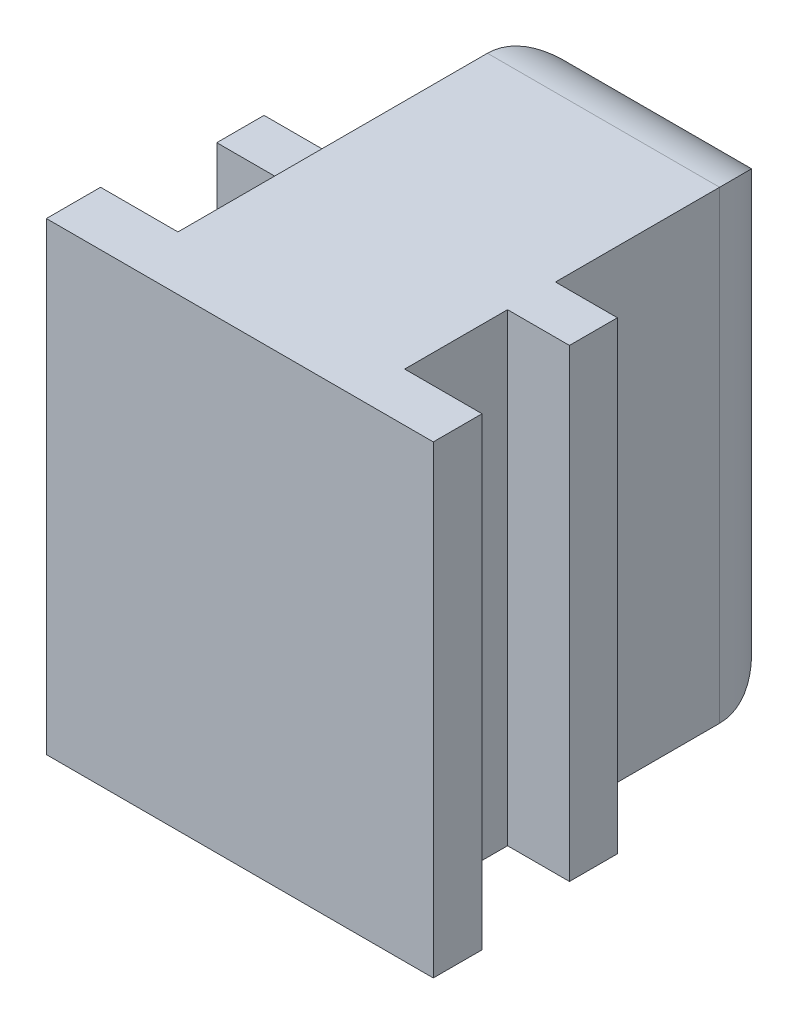
ISO-10303-21;
HEADER;
FILE_DESCRIPTION(('STEP AP214'),'2;1');
FILE_NAME('part.step','',(''),(''),'','','');
FILE_SCHEMA(('AUTOMOTIVE_DESIGN { 1 0 10303 214 1 1 1 1 }'));
ENDSEC;
DATA;
#1=APPLICATION_CONTEXT('core data for automotive mechanical design processes');
#2=APPLICATION_PROTOCOL_DEFINITION('international standard','automotive_design',2000,#1);
#3=PRODUCT_CONTEXT('',#1,'mechanical');
#4=PRODUCT('Part','Part','',(#3));
#5=PRODUCT_RELATED_PRODUCT_CATEGORY('part','',(#4));
#6=PRODUCT_DEFINITION_FORMATION('','',#4);
#7=PRODUCT_DEFINITION_CONTEXT('part definition',#1,'design');
#8=PRODUCT_DEFINITION('design','',#6,#7);
#9=PRODUCT_DEFINITION_SHAPE('','',#8);
#10=(LENGTH_UNIT() NAMED_UNIT(*) SI_UNIT(.MILLI.,.METRE.));
#11=(NAMED_UNIT(*) PLANE_ANGLE_UNIT() SI_UNIT($,.RADIAN.));
#12=(NAMED_UNIT(*) SI_UNIT($,.STERADIAN.) SOLID_ANGLE_UNIT());
#13=UNCERTAINTY_MEASURE_WITH_UNIT(LENGTH_MEASURE(1.E-05),#10,'distance_accuracy_value','');
#14=(GEOMETRIC_REPRESENTATION_CONTEXT(3) GLOBAL_UNCERTAINTY_ASSIGNED_CONTEXT((#13)) GLOBAL_UNIT_ASSIGNED_CONTEXT((#10,
#11,#12)) REPRESENTATION_CONTEXT('',''));
#15=CARTESIAN_POINT('',(0.,0.,0.));
#16=DIRECTION('',(0.,0.,1.));
#17=DIRECTION('',(1.,0.,0.));
#18=AXIS2_PLACEMENT_3D('',#15,#16,#17);
#19=CARTESIAN_POINT('',(0.,0.,4.2));
#20=DIRECTION('',(0.,0.,1.));
#21=DIRECTION('',(1.,0.,0.));
#22=AXIS2_PLACEMENT_3D('',#19,#20,#21);
#23=PLANE('',#22);
#24=DIRECTION('',(0.,1.,0.));
#25=VECTOR('',#24,1.);
#26=CARTESIAN_POINT('',(-3.03853997780115,1.18298219692962,4.2));
#27=LINE('',#26,#25);
#28=CARTESIAN_POINT('',(-3.03853997780115,-4.81701780307038,4.2));
#29=VERTEX_POINT('',#28);
#30=CARTESIAN_POINT('',(-3.03853997780115,1.18298219692962,4.2));
#31=VERTEX_POINT('',#30);
#32=EDGE_CURVE('E232',#29,#31,#27,.T.);
#33=ORIENTED_EDGE('',*,*,#32,.F.);
#34=DIRECTION('',(-1.,0.,0.));
#35=VECTOR('',#34,1.);
#36=CARTESIAN_POINT('',(-3.03853997780115,-4.81701780307038,4.2));
#37=LINE('',#36,#35);
#38=CARTESIAN_POINT('',(1.96146002219886,-4.81701780307038,4.2));
#39=VERTEX_POINT('',#38);
#40=EDGE_CURVE('E59',#39,#29,#37,.T.);
#41=ORIENTED_EDGE('',*,*,#40,.F.);
#42=DIRECTION('',(0.,-1.,0.));
#43=VECTOR('',#42,1.);
#44=CARTESIAN_POINT('',(1.96146002219885,1.18298219692962,4.2));
#45=LINE('',#44,#43);
#46=CARTESIAN_POINT('',(1.96146002219885,1.18298219692962,4.2));
#47=VERTEX_POINT('',#46);
#48=EDGE_CURVE('E241',#47,#39,#45,.T.);
#49=ORIENTED_EDGE('',*,*,#48,.F.);
#50=DIRECTION('',(1.,0.,0.));
#51=VECTOR('',#50,1.);
#52=CARTESIAN_POINT('',(1.96146002219885,1.18298219692962,4.2));
#53=LINE('',#52,#51);
#54=EDGE_CURVE('E233',#31,#47,#53,.T.);
#55=ORIENTED_EDGE('',*,*,#54,.F.);
#56=EDGE_LOOP('',(#33,#41,#49,#55));
#57=FACE_BOUND('',#56,.T.);
#58=ADVANCED_FACE('F44',(#57),#23,.T.);
#59=CARTESIAN_POINT('',(-3.53853997780115,1.18298219692962,3.5));
#60=DIRECTION('',(0.,0.,1.));
#61=DIRECTION('',(1.,0.,0.));
#62=AXIS2_PLACEMENT_3D('',#59,#60,#61);
#63=PLANE('',#62);
#64=DIRECTION('',(1.,0.,0.));
#65=VECTOR('',#64,1.);
#66=CARTESIAN_POINT('',(-3.03853997780115,-4.81701780307038,3.5));
#67=LINE('',#66,#65);
#68=CARTESIAN_POINT('',(-3.03853997780115,-4.81701780307038,3.5));
#69=VERTEX_POINT('',#68);
#70=CARTESIAN_POINT('',(-2.0806114774885,-4.81701780307038,3.5));
#71=VERTEX_POINT('',#70);
#72=EDGE_CURVE('E217',#69,#71,#67,.T.);
#73=ORIENTED_EDGE('',*,*,#72,.F.);
#74=DIRECTION('',(0.,-1.,0.));
#75=VECTOR('',#74,1.);
#76=CARTESIAN_POINT('',(-3.03853997780115,1.18298219692962,3.5));
#77=LINE('',#76,#75);
#78=CARTESIAN_POINT('',(-3.03853997780115,1.18298219692962,3.5));
#79=VERTEX_POINT('',#78);
#80=EDGE_CURVE('E225',#79,#69,#77,.T.);
#81=ORIENTED_EDGE('',*,*,#80,.F.);
#82=DIRECTION('',(1.,0.,0.));
#83=VECTOR('',#82,1.);
#84=CARTESIAN_POINT('',(-3.53853997780115,1.18298219692962,3.5));
#85=LINE('',#84,#83);
#86=CARTESIAN_POINT('',(-2.03853997780115,1.18298219692962,3.5));
#87=VERTEX_POINT('',#86);
#88=EDGE_CURVE('E255',#79,#87,#85,.T.);
#89=ORIENTED_EDGE('',*,*,#88,.T.);
#90=DIRECTION('',(0.,-1.,0.));
#91=VECTOR('',#90,1.);
#92=CARTESIAN_POINT('',(-2.03853997780115,1.18298219692962,3.5));
#93=LINE('',#92,#91);
#94=CARTESIAN_POINT('',(-2.03853997780115,1.0826631695906,3.5));
#95=VERTEX_POINT('',#94);
#96=EDGE_CURVE('E253',#87,#95,#93,.T.);
#97=ORIENTED_EDGE('',*,*,#96,.T.);
#98=DIRECTION('',(-1.,0.,0.));
#99=VECTOR('',#98,1.);
#100=CARTESIAN_POINT('',(-2.0806114774885,1.0826631695906,3.5));
#101=LINE('',#100,#99);
#102=CARTESIAN_POINT('',(-2.0806114774885,1.0826631695906,3.5));
#103=VERTEX_POINT('',#102);
#104=EDGE_CURVE('E261',#95,#103,#101,.T.);
#105=ORIENTED_EDGE('',*,*,#104,.T.);
#106=DIRECTION('',(0.,-1.,0.));
#107=VECTOR('',#106,1.);
#108=CARTESIAN_POINT('',(-2.0806114774885,1.0826631695906,3.5));
#109=LINE('',#108,#107);
#110=EDGE_CURVE('E228',#103,#71,#109,.T.);
#111=ORIENTED_EDGE('',*,*,#110,.T.);
#112=EDGE_LOOP('',(#73,#81,#89,#97,#105,#111));
#113=FACE_BOUND('',#112,.T.);
#114=ADVANCED_FACE('F224',(#113),#63,.F.);
#115=CARTESIAN_POINT('',(1.96146002219885,0.,0.));
#116=DIRECTION('',(1.,0.,0.));
#117=DIRECTION('',(0.,1.,0.));
#118=AXIS2_PLACEMENT_3D('',#115,#116,#117);
#119=PLANE('',#118);
#120=ORIENTED_EDGE('',*,*,#48,.T.);
#121=DIRECTION('',(0.,0.,1.));
#122=VECTOR('',#121,1.);
#123=CARTESIAN_POINT('',(1.96146002219886,-4.81701780307038,4.2));
#124=LINE('',#123,#122);
#125=CARTESIAN_POINT('',(1.96146002219886,-4.81701780307038,3.56971509983861));
#126=VERTEX_POINT('',#125);
#127=EDGE_CURVE('E229',#126,#39,#124,.T.);
#128=ORIENTED_EDGE('',*,*,#127,.F.);
#129=DIRECTION('',(0.,1.,0.));
#130=VECTOR('',#129,1.);
#131=CARTESIAN_POINT('',(1.96146002219885,1.18298219692962,3.56971509983861));
#132=LINE('',#131,#130);
#133=CARTESIAN_POINT('',(1.96146002219885,1.18298219692962,3.56971509983861));
#134=VERTEX_POINT('',#133);
#135=EDGE_CURVE('E244',#126,#134,#132,.T.);
#136=ORIENTED_EDGE('',*,*,#135,.T.);
#137=DIRECTION('',(0.,0.,-1.));
#138=VECTOR('',#137,1.);
#139=CARTESIAN_POINT('',(1.96146002219885,1.18298219692962,3.56971509983861));
#140=LINE('',#139,#138);
#141=EDGE_CURVE('E445',#47,#134,#140,.T.);
#142=ORIENTED_EDGE('',*,*,#141,.F.);
#143=EDGE_LOOP('',(#120,#128,#136,#142));
#144=FACE_BOUND('',#143,.T.);
#145=ADVANCED_FACE('F511',(#144),#119,.T.);
#146=CARTESIAN_POINT('',(-3.03853997780115,0.,0.));
#147=DIRECTION('',(-1.,0.,0.));
#148=DIRECTION('',(0.,-1.,0.));
#149=AXIS2_PLACEMENT_3D('',#146,#147,#148);
#150=PLANE('',#149);
#151=ORIENTED_EDGE('',*,*,#80,.T.);
#152=DIRECTION('',(0.,0.,-1.));
#153=VECTOR('',#152,1.);
#154=CARTESIAN_POINT('',(-3.03853997780115,-4.81701780307038,4.2));
#155=LINE('',#154,#153);
#156=EDGE_CURVE('E212',#29,#69,#155,.T.);
#157=ORIENTED_EDGE('',*,*,#156,.F.);
#158=ORIENTED_EDGE('',*,*,#32,.T.);
#159=DIRECTION('',(0.,0.,-1.));
#160=VECTOR('',#159,1.);
#161=CARTESIAN_POINT('',(-3.03853997780115,1.18298219692962,3.5));
#162=LINE('',#161,#160);
#163=EDGE_CURVE('E67',#31,#79,#162,.T.);
#164=ORIENTED_EDGE('',*,*,#163,.T.);
#165=EDGE_LOOP('',(#151,#157,#158,#164));
#166=FACE_BOUND('',#165,.T.);
#167=ADVANCED_FACE('F231',(#166),#150,.T.);
#168=CARTESIAN_POINT('',(-2.03853997780115,-4.81701780307038,3.5));
#169=DIRECTION('',(0.,1.,0.));
#170=DIRECTION('',(0.,0.,1.));
#171=AXIS2_PLACEMENT_3D('',#168,#169,#170);
#172=PLANE('',#171);
#173=DIRECTION('',(-1.,0.,0.));
#174=VECTOR('',#173,1.);
#175=CARTESIAN_POINT('',(1.76146002219886,-4.81701780307038,2.24019988601398));
#176=LINE('',#175,#174);
#177=CARTESIAN_POINT('',(1.76146002219886,-4.81701780307038,2.24019988601398));
#178=VERTEX_POINT('',#177);
#179=CARTESIAN_POINT('',(0.961460022198855,-4.81701780307038,2.24019988601398));
#180=VERTEX_POINT('',#179);
#181=EDGE_CURVE('E325',#178,#180,#176,.T.);
#182=ORIENTED_EDGE('',*,*,#181,.T.);
#183=DIRECTION('',(0.,0.,-1.));
#184=VECTOR('',#183,1.);
#185=CARTESIAN_POINT('',(0.961460022198855,-4.81701780307038,3.5));
#186=LINE('',#185,#184);
#187=CARTESIAN_POINT('',(0.961460022198855,-4.81701780307038,3.56971509983861));
#188=VERTEX_POINT('',#187);
#189=EDGE_CURVE('E363',#188,#180,#186,.T.);
#190=ORIENTED_EDGE('',*,*,#189,.F.);
#191=DIRECTION('',(-1.,0.,0.));
#192=VECTOR('',#191,1.);
#193=CARTESIAN_POINT('',(2.46146002219885,-4.81701780307038,3.56971509983861));
#194=LINE('',#193,#192);
#195=EDGE_CURVE('E250',#126,#188,#194,.T.);
#196=ORIENTED_EDGE('',*,*,#195,.F.);
#197=ORIENTED_EDGE('',*,*,#127,.T.);
#198=ORIENTED_EDGE('',*,*,#40,.T.);
#199=ORIENTED_EDGE('',*,*,#156,.T.);
#200=ORIENTED_EDGE('',*,*,#72,.T.);
#201=CARTESIAN_POINT('',(0.864272382543163,-4.81701780307038,3.5));
#202=VERTEX_POINT('',#201);
#203=EDGE_CURVE('E220',#71,#202,#67,.T.);
#204=ORIENTED_EDGE('',*,*,#203,.T.);
#205=DIRECTION('',(0.,0.,-1.));
#206=VECTOR('',#205,1.);
#207=CARTESIAN_POINT('',(0.864272382543163,-4.81701780307038,3.5));
#208=LINE('',#207,#206);
#209=CARTESIAN_POINT('',(0.864272382543163,-4.81701780307038,1.5));
#210=VERTEX_POINT('',#209);
#211=EDGE_CURVE('E298',#202,#210,#208,.T.);
#212=ORIENTED_EDGE('',*,*,#211,.T.);
#213=DIRECTION('',(1.,0.,0.));
#214=VECTOR('',#213,1.);
#215=CARTESIAN_POINT('',(-2.03853997780115,-4.81701780307038,1.5));
#216=LINE('',#215,#214);
#217=CARTESIAN_POINT('',(-2.03853997780115,-4.81701780307038,1.5));
#218=VERTEX_POINT('',#217);
#219=EDGE_CURVE('E12',#218,#210,#216,.T.);
#220=ORIENTED_EDGE('',*,*,#219,.F.);
#221=DIRECTION('',(0.,0.,-1.));
#222=VECTOR('',#221,1.);
#223=CARTESIAN_POINT('',(-2.03853997780115,-4.81701780307038,3.5));
#224=LINE('',#223,#222);
#225=CARTESIAN_POINT('',(-2.03853997780115,-4.81701780307038,-0.5));
#226=VERTEX_POINT('',#225);
#227=EDGE_CURVE('E365',#218,#226,#224,.T.);
#228=ORIENTED_EDGE('',*,*,#227,.T.);
#229=DIRECTION('',(-1.,0.,0.));
#230=VECTOR('',#229,1.);
#231=CARTESIAN_POINT('',(0.961460022198854,-4.81701780307038,-0.5));
#232=LINE('',#231,#230);
#233=CARTESIAN_POINT('',(0.961460022198855,-4.81701780307038,-0.5));
#234=VERTEX_POINT('',#233);
#235=EDGE_CURVE('E379',#226,#234,#232,.F.);
#236=ORIENTED_EDGE('',*,*,#235,.T.);
#237=CARTESIAN_POINT('',(0.961460022198855,-4.81701780307038,1.62098229297669));
#238=VERTEX_POINT('',#237);
#239=EDGE_CURVE('E362',#238,#234,#186,.T.);
#240=ORIENTED_EDGE('',*,*,#239,.F.);
#241=DIRECTION('',(-1.,0.,0.));
#242=VECTOR('',#241,1.);
#243=CARTESIAN_POINT('',(1.76146002219886,-4.81701780307038,1.62098229297669));
#244=LINE('',#243,#242);
#245=CARTESIAN_POINT('',(1.76146002219886,-4.81701780307038,1.62098229297669));
#246=VERTEX_POINT('',#245);
#247=EDGE_CURVE('E323',#246,#238,#244,.T.);
#248=ORIENTED_EDGE('',*,*,#247,.F.);
#249=DIRECTION('',(0.,0.,-1.));
#250=VECTOR('',#249,1.);
#251=CARTESIAN_POINT('',(1.76146002219886,-4.81701780307038,2.24019988601398));
#252=LINE('',#251,#250);
#253=EDGE_CURVE('E307',#178,#246,#252,.T.);
#254=ORIENTED_EDGE('',*,*,#253,.F.);
#255=EDGE_LOOP('',(#182,#190,#196,#197,#198,#199,#200,#204,#212,#220,#228,#236,#240,#248,#254));
#256=FACE_BOUND('',#255,.T.);
#257=ADVANCED_FACE('F215',(#256),#172,.F.);
#258=CARTESIAN_POINT('',(-2.03853997780115,1.18298219692962,3.5));
#259=DIRECTION('',(0.,-1.,0.));
#260=DIRECTION('',(0.,0.,-1.));
#261=AXIS2_PLACEMENT_3D('',#258,#259,#260);
#262=PLANE('',#261);
#263=ORIENTED_EDGE('',*,*,#163,.F.);
#264=ORIENTED_EDGE('',*,*,#54,.T.);
#265=ORIENTED_EDGE('',*,*,#141,.T.);
#266=DIRECTION('',(-1.,0.,0.));
#267=VECTOR('',#266,1.);
#268=CARTESIAN_POINT('',(1.96146002219885,1.18298219692962,3.56971509983861));
#269=LINE('',#268,#267);
#270=CARTESIAN_POINT('',(0.961460022198855,1.18298219692962,3.56971509983861));
#271=VERTEX_POINT('',#270);
#272=EDGE_CURVE('E236',#134,#271,#269,.T.);
#273=ORIENTED_EDGE('',*,*,#272,.T.);
#274=DIRECTION('',(0.,0.,-1.));
#275=VECTOR('',#274,1.);
#276=CARTESIAN_POINT('',(0.961460022198854,1.18298219692962,3.5));
#277=LINE('',#276,#275);
#278=CARTESIAN_POINT('',(0.961460022198854,1.18298219692962,2.24019988601398));
#279=VERTEX_POINT('',#278);
#280=EDGE_CURVE('E360',#271,#279,#277,.T.);
#281=ORIENTED_EDGE('',*,*,#280,.T.);
#282=DIRECTION('',(-1.,0.,0.));
#283=VECTOR('',#282,1.);
#284=CARTESIAN_POINT('',(1.76146002219885,1.18298219692962,2.24019988601398));
#285=LINE('',#284,#283);
#286=CARTESIAN_POINT('',(1.76146002219885,1.18298219692962,2.24019988601398));
#287=VERTEX_POINT('',#286);
#288=EDGE_CURVE('E314',#287,#279,#285,.T.);
#289=ORIENTED_EDGE('',*,*,#288,.F.);
#290=DIRECTION('',(0.,0.,1.));
#291=VECTOR('',#290,1.);
#292=CARTESIAN_POINT('',(1.76146002219885,1.18298219692962,2.24019988601398));
#293=LINE('',#292,#291);
#294=CARTESIAN_POINT('',(1.76146002219885,1.18298219692962,1.62098229297669));
#295=VERTEX_POINT('',#294);
#296=EDGE_CURVE('E312',#295,#287,#293,.T.);
#297=ORIENTED_EDGE('',*,*,#296,.F.);
#298=DIRECTION('',(-1.,0.,0.));
#299=VECTOR('',#298,1.);
#300=CARTESIAN_POINT('',(1.76146002219885,1.18298219692962,1.62098229297669));
#301=LINE('',#300,#299);
#302=CARTESIAN_POINT('',(0.961460022198854,1.18298219692962,1.62098229297669));
#303=VERTEX_POINT('',#302);
#304=EDGE_CURVE('E321',#295,#303,#301,.T.);
#305=ORIENTED_EDGE('',*,*,#304,.T.);
#306=CARTESIAN_POINT('',(0.961460022198854,1.18298219692962,-0.5));
#307=VERTEX_POINT('',#306);
#308=EDGE_CURVE('E358',#303,#307,#277,.T.);
#309=ORIENTED_EDGE('',*,*,#308,.T.);
#310=DIRECTION('',(1.,0.,0.));
#311=VECTOR('',#310,1.);
#312=CARTESIAN_POINT('',(-2.03853997780115,1.18298219692962,-0.5));
#313=LINE('',#312,#311);
#314=CARTESIAN_POINT('',(-2.03853997780115,1.18298219692962,-0.5));
#315=VERTEX_POINT('',#314);
#316=EDGE_CURVE('E376',#307,#315,#313,.F.);
#317=ORIENTED_EDGE('',*,*,#316,.T.);
#318=DIRECTION('',(0.,0.,-1.));
#319=VECTOR('',#318,1.);
#320=CARTESIAN_POINT('',(-2.03853997780115,1.18298219692962,3.5));
#321=LINE('',#320,#319);
#322=EDGE_CURVE('E356',#87,#315,#321,.T.);
#323=ORIENTED_EDGE('',*,*,#322,.F.);
#324=ORIENTED_EDGE('',*,*,#88,.F.);
#325=EDGE_LOOP('',(#263,#264,#265,#273,#281,#289,#297,#305,#309,#317,#323,#324));
#326=FACE_BOUND('',#325,.T.);
#327=ADVANCED_FACE('F452',(#326),#262,.F.);
#328=CARTESIAN_POINT('',(2.46146002219885,1.18298219692962,3.56971509983861));
#329=DIRECTION('',(0.,0.,1.));
#330=DIRECTION('',(1.,0.,0.));
#331=AXIS2_PLACEMENT_3D('',#328,#329,#330);
#332=PLANE('',#331);
#333=DIRECTION('',(0.,1.,0.));
#334=VECTOR('',#333,1.);
#335=CARTESIAN_POINT('',(0.961460022198854,1.18298219692962,3.56971509983861));
#336=LINE('',#335,#334);
#337=EDGE_CURVE('E247',#188,#271,#336,.T.);
#338=ORIENTED_EDGE('',*,*,#337,.T.);
#339=ORIENTED_EDGE('',*,*,#272,.F.);
#340=ORIENTED_EDGE('',*,*,#135,.F.);
#341=ORIENTED_EDGE('',*,*,#195,.T.);
#342=EDGE_LOOP('',(#338,#339,#340,#341));
#343=FACE_BOUND('',#342,.T.);
#344=ADVANCED_FACE('F459',(#343),#332,.F.);
#345=CARTESIAN_POINT('',(0.961460022198854,1.18298219692962,3.5));
#346=DIRECTION('',(-1.,0.,0.));
#347=DIRECTION('',(0.,-1.,0.));
#348=AXIS2_PLACEMENT_3D('',#345,#346,#347);
#349=PLANE('',#348);
#350=ORIENTED_EDGE('',*,*,#337,.F.);
#351=ORIENTED_EDGE('',*,*,#189,.T.);
#352=DIRECTION('',(0.,-1.,0.));
#353=VECTOR('',#352,1.);
#354=CARTESIAN_POINT('',(0.961460022198854,1.18298219692962,2.24019988601398));
#355=LINE('',#354,#353);
#356=EDGE_CURVE('E303',#279,#180,#355,.T.);
#357=ORIENTED_EDGE('',*,*,#356,.F.);
#358=ORIENTED_EDGE('',*,*,#280,.F.);
#359=EDGE_LOOP('',(#350,#351,#357,#358));
#360=FACE_BOUND('',#359,.T.);
#361=ADVANCED_FACE('F462',(#360),#349,.F.);
#362=CARTESIAN_POINT('',(-2.03853997780115,1.18298219692962,3.5));
#363=DIRECTION('',(1.,0.,0.));
#364=DIRECTION('',(0.,1.,0.));
#365=AXIS2_PLACEMENT_3D('',#362,#363,#364);
#366=PLANE('',#365);
#367=ORIENTED_EDGE('',*,*,#96,.F.);
#368=ORIENTED_EDGE('',*,*,#322,.T.);
#369=DIRECTION('',(0.,1.,0.));
#370=VECTOR('',#369,1.);
#371=CARTESIAN_POINT('',(-2.03853997780115,-4.81701780307038,-0.5));
#372=LINE('',#371,#370);
#373=EDGE_CURVE('E382',#315,#226,#372,.F.);
#374=ORIENTED_EDGE('',*,*,#373,.T.);
#375=ORIENTED_EDGE('',*,*,#227,.F.);
#376=DIRECTION('',(0.,-1.,0.));
#377=VECTOR('',#376,1.);
#378=CARTESIAN_POINT('',(-2.03853997780115,1.18298219692962,1.5));
#379=LINE('',#378,#377);
#380=CARTESIAN_POINT('',(-2.03853997780115,1.0826631695906,1.5));
#381=VERTEX_POINT('',#380);
#382=EDGE_CURVE('E301',#381,#218,#379,.T.);
#383=ORIENTED_EDGE('',*,*,#382,.F.);
#384=DIRECTION('',(0.,0.,1.));
#385=VECTOR('',#384,1.);
#386=CARTESIAN_POINT('',(-2.03853997780115,1.0826631695906,3.5));
#387=LINE('',#386,#385);
#388=CARTESIAN_POINT('',(-2.03853997780115,1.0826631695906,1.58702970190228));
#389=VERTEX_POINT('',#388);
#390=EDGE_CURVE('E289',#381,#389,#387,.T.);
#391=ORIENTED_EDGE('',*,*,#390,.T.);
#392=DIRECTION('',(0.,-1.,0.));
#393=VECTOR('',#392,1.);
#394=CARTESIAN_POINT('',(-2.03853997780115,1.13120622461976,1.58702970190228));
#395=LINE('',#394,#393);
#396=CARTESIAN_POINT('',(-2.03853997780115,1.13120622461976,1.58702970190228));
#397=VERTEX_POINT('',#396);
#398=EDGE_CURVE('E327',#397,#389,#395,.T.);
#399=ORIENTED_EDGE('',*,*,#398,.F.);
#400=DIRECTION('',(0.,0.,-1.));
#401=VECTOR('',#400,1.);
#402=CARTESIAN_POINT('',(-2.03853997780115,1.13120622461976,1.58702970190228));
#403=LINE('',#402,#401);
#404=CARTESIAN_POINT('',(-2.03853997780115,1.13120622461976,2.19816831976873));
#405=VERTEX_POINT('',#404);
#406=EDGE_CURVE('E332',#405,#397,#403,.T.);
#407=ORIENTED_EDGE('',*,*,#406,.F.);
#408=DIRECTION('',(0.,1.,0.));
#409=VECTOR('',#408,1.);
#410=CARTESIAN_POINT('',(-2.03853997780115,1.13120622461976,2.19816831976873));
#411=LINE('',#410,#409);
#412=CARTESIAN_POINT('',(-2.03853997780115,1.0826631695906,2.19816831976873));
#413=VERTEX_POINT('',#412);
#414=EDGE_CURVE('E341',#413,#405,#411,.T.);
#415=ORIENTED_EDGE('',*,*,#414,.F.);
#416=EDGE_CURVE('E279',#413,#95,#387,.T.);
#417=ORIENTED_EDGE('',*,*,#416,.T.);
#418=EDGE_LOOP('',(#367,#368,#374,#375,#383,#391,#399,#407,#415,#417));
#419=FACE_BOUND('',#418,.T.);
#420=ADVANCED_FACE('F429',(#419),#366,.F.);
#421=CARTESIAN_POINT('',(0.864272382543163,1.0826631695906,1.5));
#422=DIRECTION('',(1.,0.,0.));
#423=DIRECTION('',(0.,0.,-1.));
#424=AXIS2_PLACEMENT_3D('',#421,#422,#423);
#425=PLANE('',#424);
#426=ORIENTED_EDGE('',*,*,#211,.F.);
#427=DIRECTION('',(0.,1.,0.));
#428=VECTOR('',#427,1.);
#429=CARTESIAN_POINT('',(0.864272382543163,1.0826631695906,3.5));
#430=LINE('',#429,#428);
#431=CARTESIAN_POINT('',(0.864272382543163,-4.85203543214041,3.5));
#432=VERTEX_POINT('',#431);
#433=EDGE_CURVE('E273',#432,#202,#430,.T.);
#434=ORIENTED_EDGE('',*,*,#433,.F.);
#435=DIRECTION('',(0.,0.,1.));
#436=VECTOR('',#435,1.);
#437=CARTESIAN_POINT('',(0.864272382543163,-4.85203543214041,1.5));
#438=LINE('',#437,#436);
#439=CARTESIAN_POINT('',(0.864272382543163,-4.85203543214041,1.5));
#440=VERTEX_POINT('',#439);
#441=EDGE_CURVE('E281',#440,#432,#438,.T.);
#442=ORIENTED_EDGE('',*,*,#441,.F.);
#443=DIRECTION('',(0.,1.,0.));
#444=VECTOR('',#443,1.);
#445=CARTESIAN_POINT('',(0.864272382543163,1.0826631695906,1.5));
#446=LINE('',#445,#444);
#447=EDGE_CURVE('E264',#440,#210,#446,.T.);
#448=ORIENTED_EDGE('',*,*,#447,.T.);
#449=EDGE_LOOP('',(#426,#434,#442,#448));
#450=FACE_BOUND('',#449,.T.);
#451=ADVANCED_FACE('F438',(#450),#425,.T.);
#452=CARTESIAN_POINT('',(-2.0806114774885,1.0826631695906,1.5));
#453=DIRECTION('',(0.,1.,0.));
#454=DIRECTION('',(0.,0.,1.));
#455=AXIS2_PLACEMENT_3D('',#452,#453,#454);
#456=PLANE('',#455);
#457=ORIENTED_EDGE('',*,*,#104,.F.);
#458=ORIENTED_EDGE('',*,*,#416,.F.);
#459=DIRECTION('',(1.,0.,0.));
#460=VECTOR('',#459,1.);
#461=CARTESIAN_POINT('',(-2.83853997780115,1.0826631695906,2.19816831976873));
#462=LINE('',#461,#460);
#463=CARTESIAN_POINT('',(-2.0806114774885,1.0826631695906,2.19816831976873));
#464=VERTEX_POINT('',#463);
#465=EDGE_CURVE('E388',#464,#413,#462,.T.);
#466=ORIENTED_EDGE('',*,*,#465,.F.);
#467=DIRECTION('',(0.,0.,1.));
#468=VECTOR('',#467,1.);
#469=CARTESIAN_POINT('',(-2.0806114774885,1.0826631695906,1.5));
#470=LINE('',#469,#468);
#471=EDGE_CURVE('E280',#464,#103,#470,.T.);
#472=ORIENTED_EDGE('',*,*,#471,.T.);
#473=EDGE_LOOP('',(#457,#458,#466,#472));
#474=FACE_BOUND('',#473,.T.);
#475=ADVANCED_FACE('F517',(#474),#456,.T.);
#476=DIRECTION('',(1.,0.,0.));
#477=VECTOR('',#476,1.);
#478=CARTESIAN_POINT('',(-2.83853997780115,-4.81701780307038,1.58702970190228));
#479=LINE('',#478,#477);
#480=CARTESIAN_POINT('',(-2.83853997780115,-4.81701780307038,1.58702970190228));
#481=VERTEX_POINT('',#480);
#482=CARTESIAN_POINT('',(-2.0806114774885,-4.81701780307038,1.58702970190228));
#483=VERTEX_POINT('',#482);
#484=EDGE_CURVE('E352',#481,#483,#479,.T.);
#485=ORIENTED_EDGE('',*,*,#484,.T.);
#486=DIRECTION('',(0.,0.,1.));
#487=VECTOR('',#486,1.);
#488=CARTESIAN_POINT('',(-2.0806114774885,-4.81701780307038,3.5));
#489=LINE('',#488,#487);
#490=CARTESIAN_POINT('',(-2.0806114774885,-4.81701780307038,2.19816831976873));
#491=VERTEX_POINT('',#490);
#492=EDGE_CURVE('E292',#483,#491,#489,.T.);
#493=ORIENTED_EDGE('',*,*,#492,.T.);
#494=DIRECTION('',(1.,0.,0.));
#495=VECTOR('',#494,1.);
#496=CARTESIAN_POINT('',(-2.83853997780115,-4.81701780307038,2.19816831976873));
#497=LINE('',#496,#495);
#498=CARTESIAN_POINT('',(-2.83853997780115,-4.81701780307038,2.19816831976873));
#499=VERTEX_POINT('',#498);
#500=EDGE_CURVE('E349',#499,#491,#497,.T.);
#501=ORIENTED_EDGE('',*,*,#500,.F.);
#502=DIRECTION('',(0.,0.,1.));
#503=VECTOR('',#502,1.);
#504=CARTESIAN_POINT('',(-2.83853997780115,-4.81701780307038,1.58702970190228));
#505=LINE('',#504,#503);
#506=EDGE_CURVE('E331',#481,#499,#505,.T.);
#507=ORIENTED_EDGE('',*,*,#506,.F.);
#508=EDGE_LOOP('',(#485,#493,#501,#507));
#509=FACE_BOUND('',#508,.T.);
#510=ADVANCED_FACE('F410',(#509),#172,.F.);
#511=DIRECTION('',(0.,1.,0.));
#512=VECTOR('',#511,1.);
#513=CARTESIAN_POINT('',(0.961460022198854,1.18298219692962,1.62098229297669));
#514=LINE('',#513,#512);
#515=EDGE_CURVE('E308',#238,#303,#514,.T.);
#516=ORIENTED_EDGE('',*,*,#515,.F.);
#517=ORIENTED_EDGE('',*,*,#239,.T.);
#518=DIRECTION('',(0.,-1.,0.));
#519=VECTOR('',#518,1.);
#520=CARTESIAN_POINT('',(0.961460022198854,1.18298219692962,-0.5));
#521=LINE('',#520,#519);
#522=EDGE_CURVE('E385',#234,#307,#521,.F.);
#523=ORIENTED_EDGE('',*,*,#522,.T.);
#524=ORIENTED_EDGE('',*,*,#308,.F.);
#525=EDGE_LOOP('',(#516,#517,#523,#524));
#526=FACE_BOUND('',#525,.T.);
#527=ADVANCED_FACE('F478',(#526),#349,.F.);
#528=CARTESIAN_POINT('',(0.,0.,-1.5));
#529=DIRECTION('',(0.,0.,-1.));
#530=DIRECTION('',(-1.,0.,0.));
#531=AXIS2_PLACEMENT_3D('',#528,#529,#530);
#532=PLANE('',#531);
#533=DIRECTION('',(-1.,0.,0.));
#534=VECTOR('',#533,1.);
#535=CARTESIAN_POINT('',(-2.03853997780115,-3.81701780307038,-1.5));
#536=LINE('',#535,#534);
#537=CARTESIAN_POINT('',(-0.0385399778011451,-3.81701780307038,-1.5));
#538=VERTEX_POINT('',#537);
#539=CARTESIAN_POINT('',(-1.03853997780115,-3.81701780307038,-1.5));
#540=VERTEX_POINT('',#539);
#541=EDGE_CURVE('E369',#538,#540,#536,.T.);
#542=ORIENTED_EDGE('',*,*,#541,.T.);
#543=DIRECTION('',(0.,1.,0.));
#544=VECTOR('',#543,1.);
#545=CARTESIAN_POINT('',(-1.03853997780115,1.18298219692962,-1.5));
#546=LINE('',#545,#544);
#547=CARTESIAN_POINT('',(-1.03853997780115,0.182982196929617,-1.5));
#548=VERTEX_POINT('',#547);
#549=EDGE_CURVE('E374',#540,#548,#546,.T.);
#550=ORIENTED_EDGE('',*,*,#549,.T.);
#551=DIRECTION('',(1.,0.,0.));
#552=VECTOR('',#551,1.);
#553=CARTESIAN_POINT('',(0.961460022198854,0.182982196929617,-1.5));
#554=LINE('',#553,#552);
#555=CARTESIAN_POINT('',(-0.0385399778011458,0.182982196929617,-1.5));
#556=VERTEX_POINT('',#555);
#557=EDGE_CURVE('E371',#548,#556,#554,.T.);
#558=ORIENTED_EDGE('',*,*,#557,.T.);
#559=DIRECTION('',(0.,-1.,0.));
#560=VECTOR('',#559,1.);
#561=CARTESIAN_POINT('',(-0.0385399778011449,-4.81701780307038,-1.5));
#562=LINE('',#561,#560);
#563=EDGE_CURVE('E367',#556,#538,#562,.T.);
#564=ORIENTED_EDGE('',*,*,#563,.T.);
#565=EDGE_LOOP('',(#542,#550,#558,#564));
#566=FACE_BOUND('',#565,.T.);
#567=ADVANCED_FACE('F492',(#566),#532,.T.);
#568=CARTESIAN_POINT('',(0.,-3.81701780307038,-0.5));
#569=DIRECTION('',(1.,0.,0.));
#570=DIRECTION('',(0.,0.,-1.));
#571=AXIS2_PLACEMENT_3D('',#568,#569,#570);
#572=CYLINDRICAL_SURFACE('',#571,1.);
#573=CARTESIAN_POINT('',(-0.0385399778011451,-3.81701780307038,-0.5));
#574=DIRECTION('',(0.707106781186547,0.707106781186548,0.));
#575=DIRECTION('',(-0.707106781186548,0.707106781186547,0.));
#576=AXIS2_PLACEMENT_3D('',#573,#574,#575);
#577=ELLIPSE('',#576,1.4142135623731,1.);
#578=EDGE_CURVE('E393',#234,#538,#577,.T.);
#579=ORIENTED_EDGE('',*,*,#578,.F.);
#580=ORIENTED_EDGE('',*,*,#235,.F.);
#581=CARTESIAN_POINT('',(-1.03853997780115,-3.81701780307038,-0.5));
#582=DIRECTION('',(0.707106781186547,-0.707106781186547,0.));
#583=DIRECTION('',(-0.707106781186547,-0.707106781186548,0.));
#584=AXIS2_PLACEMENT_3D('',#581,#582,#583);
#585=ELLIPSE('',#584,1.41421356237309,1.);
#586=EDGE_CURVE('E359',#540,#226,#585,.F.);
#587=ORIENTED_EDGE('',*,*,#586,.F.);
#588=ORIENTED_EDGE('',*,*,#541,.F.);
#589=EDGE_LOOP('',(#579,#580,#587,#588));
#590=FACE_BOUND('',#589,.T.);
#591=ADVANCED_FACE('F46',(#590),#572,.T.);
#592=CARTESIAN_POINT('',(-1.03853997780115,0.,-0.5));
#593=DIRECTION('',(0.,-1.,0.));
#594=DIRECTION('',(1.,0.,0.));
#595=AXIS2_PLACEMENT_3D('',#592,#593,#594);
#596=CYLINDRICAL_SURFACE('',#595,1.);
#597=ORIENTED_EDGE('',*,*,#586,.T.);
#598=ORIENTED_EDGE('',*,*,#373,.F.);
#599=CARTESIAN_POINT('',(-1.03853997780115,0.182982196929617,-0.5));
#600=DIRECTION('',(-0.707106781186547,-0.707106781186548,0.));
#601=DIRECTION('',(0.707106781186547,-0.707106781186547,0.));
#602=AXIS2_PLACEMENT_3D('',#599,#600,#601);
#603=ELLIPSE('',#602,1.4142135623731,1.);
#604=EDGE_CURVE('E390',#548,#315,#603,.F.);
#605=ORIENTED_EDGE('',*,*,#604,.F.);
#606=ORIENTED_EDGE('',*,*,#549,.F.);
#607=EDGE_LOOP('',(#597,#598,#605,#606));
#608=FACE_BOUND('',#607,.T.);
#609=ADVANCED_FACE('F496',(#608),#596,.T.);
#610=CARTESIAN_POINT('',(-0.0385399778011457,0.,-0.5));
#611=DIRECTION('',(0.,1.,0.));
#612=DIRECTION('',(-1.,0.,0.));
#613=AXIS2_PLACEMENT_3D('',#610,#611,#612);
#614=CYLINDRICAL_SURFACE('',#613,1.);
#615=ORIENTED_EDGE('',*,*,#578,.T.);
#616=ORIENTED_EDGE('',*,*,#563,.F.);
#617=CARTESIAN_POINT('',(-0.0385399778011458,0.182982196929617,-0.5));
#618=DIRECTION('',(-0.707106781186548,0.707106781186547,0.));
#619=DIRECTION('',(0.707106781186547,0.707106781186548,0.));
#620=AXIS2_PLACEMENT_3D('',#617,#618,#619);
#621=ELLIPSE('',#620,1.41421356237309,1.);
#622=EDGE_CURVE('E355',#307,#556,#621,.T.);
#623=ORIENTED_EDGE('',*,*,#622,.F.);
#624=ORIENTED_EDGE('',*,*,#522,.F.);
#625=EDGE_LOOP('',(#615,#616,#623,#624));
#626=FACE_BOUND('',#625,.T.);
#627=ADVANCED_FACE('F489',(#626),#614,.T.);
#628=CARTESIAN_POINT('',(0.,0.182982196929617,-0.5));
#629=DIRECTION('',(-1.,0.,0.));
#630=DIRECTION('',(0.,0.,1.));
#631=AXIS2_PLACEMENT_3D('',#628,#629,#630);
#632=CYLINDRICAL_SURFACE('',#631,1.);
#633=ORIENTED_EDGE('',*,*,#604,.T.);
#634=ORIENTED_EDGE('',*,*,#316,.F.);
#635=ORIENTED_EDGE('',*,*,#622,.T.);
#636=ORIENTED_EDGE('',*,*,#557,.F.);
#637=EDGE_LOOP('',(#633,#634,#635,#636));
#638=FACE_BOUND('',#637,.T.);
#639=ADVANCED_FACE('F484',(#638),#632,.T.);
#640=CARTESIAN_POINT('',(-2.83853997780115,1.13120622461976,1.58702970190228));
#641=DIRECTION('',(0.,0.,1.));
#642=DIRECTION('',(1.,0.,0.));
#643=AXIS2_PLACEMENT_3D('',#640,#641,#642);
#644=PLANE('',#643);
#645=DIRECTION('',(-1.,0.,0.));
#646=VECTOR('',#645,1.);
#647=CARTESIAN_POINT('',(-2.83853997780115,1.0826631695906,1.58702970190228));
#648=LINE('',#647,#646);
#649=CARTESIAN_POINT('',(-2.0806114774885,1.0826631695906,1.58702970190228));
#650=VERTEX_POINT('',#649);
#651=EDGE_CURVE('E288',#389,#650,#648,.T.);
#652=ORIENTED_EDGE('',*,*,#651,.T.);
#653=DIRECTION('',(0.,-1.,0.));
#654=VECTOR('',#653,1.);
#655=CARTESIAN_POINT('',(-2.0806114774885,1.13120622461976,1.58702970190228));
#656=LINE('',#655,#654);
#657=EDGE_CURVE('E295',#650,#483,#656,.T.);
#658=ORIENTED_EDGE('',*,*,#657,.T.);
#659=ORIENTED_EDGE('',*,*,#484,.F.);
#660=DIRECTION('',(0.,-1.,0.));
#661=VECTOR('',#660,1.);
#662=CARTESIAN_POINT('',(-2.83853997780115,1.13120622461976,1.58702970190228));
#663=LINE('',#662,#661);
#664=CARTESIAN_POINT('',(-2.83853997780115,1.13120622461976,1.58702970190228));
#665=VERTEX_POINT('',#664);
#666=EDGE_CURVE('E328',#665,#481,#663,.T.);
#667=ORIENTED_EDGE('',*,*,#666,.F.);
#668=DIRECTION('',(1.,0.,0.));
#669=VECTOR('',#668,1.);
#670=CARTESIAN_POINT('',(-2.83853997780115,1.13120622461976,1.58702970190228));
#671=LINE('',#670,#669);
#672=EDGE_CURVE('E338',#665,#397,#671,.T.);
#673=ORIENTED_EDGE('',*,*,#672,.T.);
#674=ORIENTED_EDGE('',*,*,#398,.T.);
#675=EDGE_LOOP('',(#652,#658,#659,#667,#673,#674));
#676=FACE_BOUND('',#675,.T.);
#677=ADVANCED_FACE('F414',(#676),#644,.F.);
#678=CARTESIAN_POINT('',(-2.83853997780115,1.13120622461976,2.19816831976873));
#679=DIRECTION('',(0.,0.,-1.));
#680=DIRECTION('',(-1.,0.,0.));
#681=AXIS2_PLACEMENT_3D('',#678,#679,#680);
#682=PLANE('',#681);
#683=ORIENTED_EDGE('',*,*,#500,.T.);
#684=DIRECTION('',(0.,1.,0.));
#685=VECTOR('',#684,1.);
#686=CARTESIAN_POINT('',(-2.0806114774885,1.13120622461976,2.19816831976873));
#687=LINE('',#686,#685);
#688=EDGE_CURVE('E52',#491,#464,#687,.T.);
#689=ORIENTED_EDGE('',*,*,#688,.T.);
#690=ORIENTED_EDGE('',*,*,#465,.T.);
#691=ORIENTED_EDGE('',*,*,#414,.T.);
#692=DIRECTION('',(1.,0.,0.));
#693=VECTOR('',#692,1.);
#694=CARTESIAN_POINT('',(-2.83853997780115,1.13120622461976,2.19816831976873));
#695=LINE('',#694,#693);
#696=CARTESIAN_POINT('',(-2.83853997780115,1.13120622461976,2.19816831976873));
#697=VERTEX_POINT('',#696);
#698=EDGE_CURVE('E346',#697,#405,#695,.T.);
#699=ORIENTED_EDGE('',*,*,#698,.F.);
#700=DIRECTION('',(0.,1.,0.));
#701=VECTOR('',#700,1.);
#702=CARTESIAN_POINT('',(-2.83853997780115,1.13120622461976,2.19816831976873));
#703=LINE('',#702,#701);
#704=EDGE_CURVE('E334',#499,#697,#703,.T.);
#705=ORIENTED_EDGE('',*,*,#704,.F.);
#706=EDGE_LOOP('',(#683,#689,#690,#691,#699,#705));
#707=FACE_BOUND('',#706,.T.);
#708=ADVANCED_FACE('F401',(#707),#682,.F.);
#709=CARTESIAN_POINT('',(-2.83853997780115,1.13120622461976,1.58702970190228));
#710=DIRECTION('',(0.,-1.,0.));
#711=DIRECTION('',(1.,0.,0.));
#712=AXIS2_PLACEMENT_3D('',#709,#710,#711);
#713=PLANE('',#712);
#714=ORIENTED_EDGE('',*,*,#406,.T.);
#715=ORIENTED_EDGE('',*,*,#672,.F.);
#716=DIRECTION('',(0.,0.,-1.));
#717=VECTOR('',#716,1.);
#718=CARTESIAN_POINT('',(-2.83853997780115,1.13120622461976,1.58702970190228));
#719=LINE('',#718,#717);
#720=EDGE_CURVE('E336',#697,#665,#719,.T.);
#721=ORIENTED_EDGE('',*,*,#720,.F.);
#722=ORIENTED_EDGE('',*,*,#698,.T.);
#723=EDGE_LOOP('',(#714,#715,#721,#722));
#724=FACE_BOUND('',#723,.T.);
#725=ADVANCED_FACE('F537',(#724),#713,.F.);
#726=CARTESIAN_POINT('',(-2.83853997780115,0.,0.));
#727=DIRECTION('',(-1.,0.,0.));
#728=DIRECTION('',(0.,-1.,0.));
#729=AXIS2_PLACEMENT_3D('',#726,#727,#728);
#730=PLANE('',#729);
#731=ORIENTED_EDGE('',*,*,#666,.T.);
#732=ORIENTED_EDGE('',*,*,#506,.T.);
#733=ORIENTED_EDGE('',*,*,#704,.T.);
#734=ORIENTED_EDGE('',*,*,#720,.T.);
#735=EDGE_LOOP('',(#731,#732,#733,#734));
#736=FACE_BOUND('',#735,.T.);
#737=ADVANCED_FACE('F534',(#736),#730,.T.);
#738=CARTESIAN_POINT('',(1.76146002219885,1.18298219692962,2.24019988601398));
#739=DIRECTION('',(0.,0.,-1.));
#740=DIRECTION('',(-1.,0.,0.));
#741=AXIS2_PLACEMENT_3D('',#738,#739,#740);
#742=PLANE('',#741);
#743=ORIENTED_EDGE('',*,*,#356,.T.);
#744=ORIENTED_EDGE('',*,*,#181,.F.);
#745=DIRECTION('',(0.,-1.,0.));
#746=VECTOR('',#745,1.);
#747=CARTESIAN_POINT('',(1.76146002219885,1.18298219692962,2.24019988601398));
#748=LINE('',#747,#746);
#749=EDGE_CURVE('E304',#287,#178,#748,.T.);
#750=ORIENTED_EDGE('',*,*,#749,.F.);
#751=ORIENTED_EDGE('',*,*,#288,.T.);
#752=EDGE_LOOP('',(#743,#744,#750,#751));
#753=FACE_BOUND('',#752,.T.);
#754=ADVANCED_FACE('F465',(#753),#742,.F.);
#755=CARTESIAN_POINT('',(1.76146002219885,1.18298219692962,1.62098229297669));
#756=DIRECTION('',(0.,0.,1.));
#757=DIRECTION('',(1.,0.,0.));
#758=AXIS2_PLACEMENT_3D('',#755,#756,#757);
#759=PLANE('',#758);
#760=ORIENTED_EDGE('',*,*,#515,.T.);
#761=ORIENTED_EDGE('',*,*,#304,.F.);
#762=DIRECTION('',(0.,1.,0.));
#763=VECTOR('',#762,1.);
#764=CARTESIAN_POINT('',(1.76146002219885,1.18298219692962,1.62098229297669));
#765=LINE('',#764,#763);
#766=EDGE_CURVE('E310',#246,#295,#765,.T.);
#767=ORIENTED_EDGE('',*,*,#766,.F.);
#768=ORIENTED_EDGE('',*,*,#247,.T.);
#769=EDGE_LOOP('',(#760,#761,#767,#768));
#770=FACE_BOUND('',#769,.T.);
#771=ADVANCED_FACE('F474',(#770),#759,.F.);
#772=CARTESIAN_POINT('',(1.76146002219885,0.,0.));
#773=DIRECTION('',(1.,0.,0.));
#774=DIRECTION('',(0.,1.,0.));
#775=AXIS2_PLACEMENT_3D('',#772,#773,#774);
#776=PLANE('',#775);
#777=ORIENTED_EDGE('',*,*,#749,.T.);
#778=ORIENTED_EDGE('',*,*,#253,.T.);
#779=ORIENTED_EDGE('',*,*,#766,.T.);
#780=ORIENTED_EDGE('',*,*,#296,.T.);
#781=EDGE_LOOP('',(#777,#778,#779,#780));
#782=FACE_BOUND('',#781,.T.);
#783=ADVANCED_FACE('F470',(#782),#776,.T.);
#784=CARTESIAN_POINT('',(0.,0.,1.5));
#785=DIRECTION('',(0.,0.,1.));
#786=DIRECTION('',(1.,0.,0.));
#787=AXIS2_PLACEMENT_3D('',#784,#785,#786);
#788=PLANE('',#787);
#789=DIRECTION('',(-1.,0.,0.));
#790=VECTOR('',#789,1.);
#791=CARTESIAN_POINT('',(-2.0806114774885,1.0826631695906,1.5));
#792=LINE('',#791,#790);
#793=CARTESIAN_POINT('',(-2.0806114774885,1.0826631695906,1.5));
#794=VERTEX_POINT('',#793);
#795=EDGE_CURVE('E267',#381,#794,#792,.T.);
#796=ORIENTED_EDGE('',*,*,#795,.F.);
#797=ORIENTED_EDGE('',*,*,#382,.T.);
#798=ORIENTED_EDGE('',*,*,#219,.T.);
#799=ORIENTED_EDGE('',*,*,#447,.F.);
#800=DIRECTION('',(1.,0.,0.));
#801=VECTOR('',#800,1.);
#802=CARTESIAN_POINT('',(-2.0806114774885,-4.85203543214041,1.5));
#803=LINE('',#802,#801);
#804=CARTESIAN_POINT('',(-2.0806114774885,-4.85203543214041,1.5));
#805=VERTEX_POINT('',#804);
#806=EDGE_CURVE('E260',#805,#440,#803,.T.);
#807=ORIENTED_EDGE('',*,*,#806,.F.);
#808=DIRECTION('',(0.,-1.,0.));
#809=VECTOR('',#808,1.);
#810=CARTESIAN_POINT('',(-2.0806114774885,1.0826631695906,1.5));
#811=LINE('',#810,#809);
#812=EDGE_CURVE('E257',#794,#805,#811,.T.);
#813=ORIENTED_EDGE('',*,*,#812,.F.);
#814=EDGE_LOOP('',(#796,#797,#798,#799,#807,#813));
#815=FACE_BOUND('',#814,.T.);
#816=ADVANCED_FACE('F423',(#815),#788,.F.);
#817=CARTESIAN_POINT('',(-2.0806114774885,1.0826631695906,1.5));
#818=DIRECTION('',(-1.,0.,0.));
#819=DIRECTION('',(0.,0.,1.));
#820=AXIS2_PLACEMENT_3D('',#817,#818,#819);
#821=PLANE('',#820);
#822=ORIENTED_EDGE('',*,*,#657,.F.);
#823=EDGE_CURVE('E276',#794,#650,#470,.T.);
#824=ORIENTED_EDGE('',*,*,#823,.F.);
#825=ORIENTED_EDGE('',*,*,#812,.T.);
#826=DIRECTION('',(0.,0.,1.));
#827=VECTOR('',#826,1.);
#828=CARTESIAN_POINT('',(-2.0806114774885,-4.85203543214041,1.5));
#829=LINE('',#828,#827);
#830=CARTESIAN_POINT('',(-2.0806114774885,-4.85203543214041,3.5));
#831=VERTEX_POINT('',#830);
#832=EDGE_CURVE('E269',#805,#831,#829,.T.);
#833=ORIENTED_EDGE('',*,*,#832,.T.);
#834=DIRECTION('',(0.,-1.,0.));
#835=VECTOR('',#834,1.);
#836=CARTESIAN_POINT('',(-2.0806114774885,1.0826631695906,3.5));
#837=LINE('',#836,#835);
#838=EDGE_CURVE('E443',#71,#831,#837,.T.);
#839=ORIENTED_EDGE('',*,*,#838,.F.);
#840=ORIENTED_EDGE('',*,*,#110,.F.);
#841=ORIENTED_EDGE('',*,*,#471,.F.);
#842=ORIENTED_EDGE('',*,*,#688,.F.);
#843=ORIENTED_EDGE('',*,*,#492,.F.);
#844=EDGE_LOOP('',(#822,#824,#825,#833,#839,#840,#841,#842,#843));
#845=FACE_BOUND('',#844,.T.);
#846=ADVANCED_FACE('F407',(#845),#821,.T.);
#847=ORIENTED_EDGE('',*,*,#390,.F.);
#848=ORIENTED_EDGE('',*,*,#795,.T.);
#849=ORIENTED_EDGE('',*,*,#823,.T.);
#850=ORIENTED_EDGE('',*,*,#651,.F.);
#851=EDGE_LOOP('',(#847,#848,#849,#850));
#852=FACE_BOUND('',#851,.T.);
#853=ADVANCED_FACE('F418',(#852),#456,.T.);
#854=CARTESIAN_POINT('',(-2.0806114774885,-4.85203543214041,1.5));
#855=DIRECTION('',(0.,-1.,0.));
#856=DIRECTION('',(0.,0.,-1.));
#857=AXIS2_PLACEMENT_3D('',#854,#855,#856);
#858=PLANE('',#857);
#859=DIRECTION('',(1.,0.,0.));
#860=VECTOR('',#859,1.);
#861=CARTESIAN_POINT('',(-2.0806114774885,-4.85203543214041,3.5));
#862=LINE('',#861,#860);
#863=EDGE_CURVE('E271',#831,#432,#862,.T.);
#864=ORIENTED_EDGE('',*,*,#863,.F.);
#865=ORIENTED_EDGE('',*,*,#832,.F.);
#866=ORIENTED_EDGE('',*,*,#806,.T.);
#867=ORIENTED_EDGE('',*,*,#441,.T.);
#868=EDGE_LOOP('',(#864,#865,#866,#867));
#869=FACE_BOUND('',#868,.T.);
#870=ADVANCED_FACE('F442',(#869),#858,.T.);
#871=CARTESIAN_POINT('',(-3.03853997780115,-4.81701780307038,3.5));
#872=DIRECTION('',(0.,0.,-1.));
#873=DIRECTION('',(-1.,0.,0.));
#874=AXIS2_PLACEMENT_3D('',#871,#872,#873);
#875=PLANE('',#874);
#876=ORIENTED_EDGE('',*,*,#433,.T.);
#877=ORIENTED_EDGE('',*,*,#203,.F.);
#878=ORIENTED_EDGE('',*,*,#838,.T.);
#879=ORIENTED_EDGE('',*,*,#863,.T.);
#880=EDGE_LOOP('',(#876,#877,#878,#879));
#881=FACE_BOUND('',#880,.T.);
#882=ADVANCED_FACE('F525',(#881),#875,.F.);
#883=CLOSED_SHELL('',(#58,#114,#145,#167,#257,#327,#344,#361,#420,#451,#475,#510,#527,#567,#591,
#609,#627,#639,#677,#708,#725,#737,#754,#771,#783,#816,#846,#853,#870,#882));
#884=MANIFOLD_SOLID_BREP('B2',#883);
#885=ADVANCED_BREP_SHAPE_REPRESENTATION('',(#18,#884),#14);
#886=SHAPE_DEFINITION_REPRESENTATION(#9,#885);
ENDSEC;
END-ISO-10303-21;
